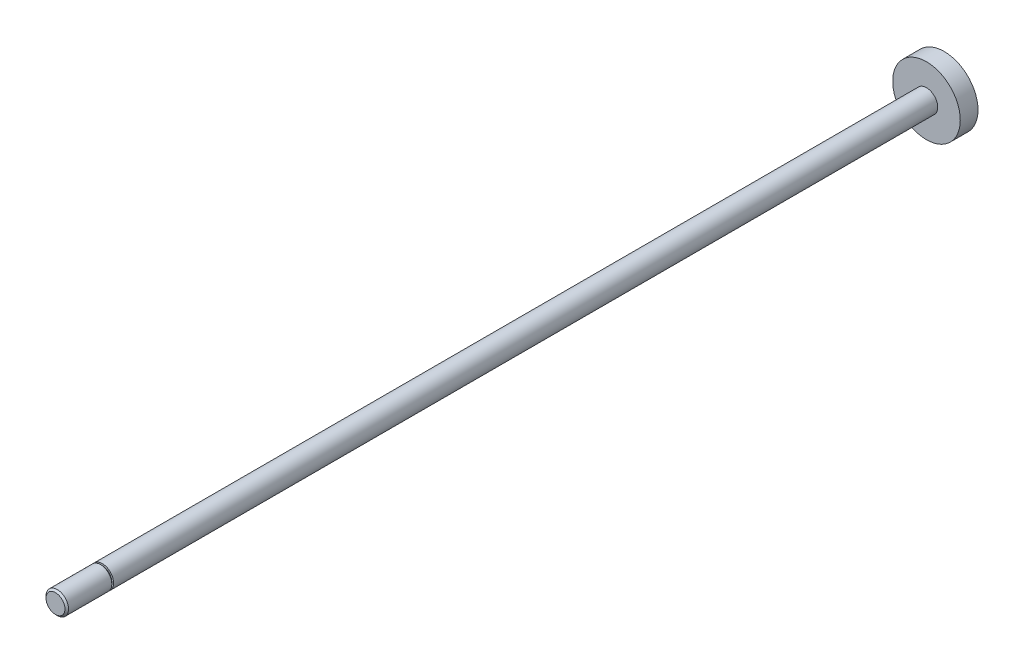
ISO-10303-21;
HEADER;
FILE_DESCRIPTION(('STEP AP214'),'2;1');
FILE_NAME('part.step','',(''),(''),'','','');
FILE_SCHEMA(('AUTOMOTIVE_DESIGN { 1 0 10303 214 1 1 1 1 }'));
ENDSEC;
DATA;
#1=APPLICATION_CONTEXT('core data for automotive mechanical design processes');
#2=APPLICATION_PROTOCOL_DEFINITION('international standard','automotive_design',2000,#1);
#3=PRODUCT_CONTEXT('',#1,'mechanical');
#4=PRODUCT('Part','Part','',(#3));
#5=PRODUCT_RELATED_PRODUCT_CATEGORY('part','',(#4));
#6=PRODUCT_DEFINITION_FORMATION('','',#4);
#7=PRODUCT_DEFINITION_CONTEXT('part definition',#1,'design');
#8=PRODUCT_DEFINITION('design','',#6,#7);
#9=PRODUCT_DEFINITION_SHAPE('','',#8);
#10=(LENGTH_UNIT() NAMED_UNIT(*) SI_UNIT(.MILLI.,.METRE.));
#11=(NAMED_UNIT(*) PLANE_ANGLE_UNIT() SI_UNIT($,.RADIAN.));
#12=(NAMED_UNIT(*) SI_UNIT($,.STERADIAN.) SOLID_ANGLE_UNIT());
#13=UNCERTAINTY_MEASURE_WITH_UNIT(LENGTH_MEASURE(1.E-05),#10,'distance_accuracy_value','');
#14=(GEOMETRIC_REPRESENTATION_CONTEXT(3) GLOBAL_UNCERTAINTY_ASSIGNED_CONTEXT((#13)) GLOBAL_UNIT_ASSIGNED_CONTEXT((#10,
#11,#12)) REPRESENTATION_CONTEXT('',''));
#15=CARTESIAN_POINT('',(0.,0.,0.));
#16=DIRECTION('',(0.,0.,1.));
#17=DIRECTION('',(1.,0.,0.));
#18=AXIS2_PLACEMENT_3D('',#15,#16,#17);
#19=CARTESIAN_POINT('',(0.,0.,2.5));
#20=DIRECTION('',(0.,0.,1.));
#21=DIRECTION('',(1.,0.,0.));
#22=AXIS2_PLACEMENT_3D('',#19,#20,#21);
#23=PLANE('',#22);
#24=CARTESIAN_POINT('',(0.,0.,2.5));
#25=DIRECTION('',(0.,0.,1.));
#26=DIRECTION('',(1.,0.,0.));
#27=AXIS2_PLACEMENT_3D('',#24,#25,#26);
#28=CIRCLE('',#27,9.525);
#29=CARTESIAN_POINT('',(9.525,0.,2.5));
#30=VERTEX_POINT('',#29);
#31=EDGE_CURVE('E38',#30,#30,#28,.T.);
#32=ORIENTED_EDGE('',*,*,#31,.T.);
#33=EDGE_LOOP('',(#32));
#34=FACE_BOUND('',#33,.T.);
#35=CARTESIAN_POINT('',(0.,0.,2.5));
#36=DIRECTION('',(0.,0.,1.));
#37=DIRECTION('',(1.,0.,0.));
#38=AXIS2_PLACEMENT_3D('',#35,#36,#37);
#39=CIRCLE('',#38,3.175);
#40=CARTESIAN_POINT('',(3.175,0.,2.5));
#41=VERTEX_POINT('',#40);
#42=EDGE_CURVE('E10',#41,#41,#39,.T.);
#43=ORIENTED_EDGE('',*,*,#42,.F.);
#44=EDGE_LOOP('',(#43));
#45=FACE_BOUND('',#44,.T.);
#46=ADVANCED_FACE('F30',(#34,#45),#23,.T.);
#47=CARTESIAN_POINT('',(0.,0.,2.5));
#48=DIRECTION('',(0.,0.,-1.));
#49=DIRECTION('',(-1.,0.,0.));
#50=AXIS2_PLACEMENT_3D('',#47,#48,#49);
#51=CYLINDRICAL_SURFACE('',#50,9.525);
#52=ORIENTED_EDGE('',*,*,#31,.F.);
#53=EDGE_LOOP('',(#52));
#54=FACE_BOUND('',#53,.T.);
#55=CARTESIAN_POINT('',(0.,0.,-2.5));
#56=DIRECTION('',(0.,0.,1.));
#57=DIRECTION('',(1.,0.,0.));
#58=AXIS2_PLACEMENT_3D('',#55,#56,#57);
#59=CIRCLE('',#58,9.525);
#60=CARTESIAN_POINT('',(9.525,0.,-2.5));
#61=VERTEX_POINT('',#60);
#62=EDGE_CURVE('E42',#61,#61,#59,.T.);
#63=ORIENTED_EDGE('',*,*,#62,.T.);
#64=EDGE_LOOP('',(#63));
#65=FACE_BOUND('',#64,.T.);
#66=ADVANCED_FACE('F92',(#54,#65),#51,.T.);
#67=CARTESIAN_POINT('',(0.,0.,-2.5));
#68=DIRECTION('',(0.,0.,1.));
#69=DIRECTION('',(1.,0.,0.));
#70=AXIS2_PLACEMENT_3D('',#67,#68,#69);
#71=PLANE('',#70);
#72=ORIENTED_EDGE('',*,*,#62,.F.);
#73=EDGE_LOOP('',(#72));
#74=FACE_BOUND('',#73,.T.);
#75=ADVANCED_FACE('F89',(#74),#71,.F.);
#76=CARTESIAN_POINT('',(0.,0.,257.011256121069));
#77=DIRECTION('',(0.,0.,-1.));
#78=DIRECTION('',(-1.,0.,0.));
#79=AXIS2_PLACEMENT_3D('',#76,#77,#78);
#80=CYLINDRICAL_SURFACE('',#79,3.175);
#81=CARTESIAN_POINT('',(0.,0.,234.831));
#82=DIRECTION('',(0.,0.,-1.));
#83=DIRECTION('',(-1.,0.,0.));
#84=AXIS2_PLACEMENT_3D('',#81,#82,#83);
#85=CIRCLE('',#84,3.175);
#86=CARTESIAN_POINT('',(-3.175,0.,234.831));
#87=VERTEX_POINT('',#86);
#88=EDGE_CURVE('E34',#87,#87,#85,.T.);
#89=ORIENTED_EDGE('',*,*,#88,.T.);
#90=EDGE_LOOP('',(#89));
#91=FACE_BOUND('',#90,.T.);
#92=ORIENTED_EDGE('',*,*,#42,.T.);
#93=EDGE_LOOP('',(#92));
#94=FACE_BOUND('',#93,.T.);
#95=ADVANCED_FACE('F32',(#91,#94),#80,.T.);
#96=CARTESIAN_POINT('',(0.,2.67499999999996,234.831));
#97=DIRECTION('',(0.,0.,-1.));
#98=DIRECTION('',(-1.,0.,0.));
#99=AXIS2_PLACEMENT_3D('',#96,#97,#98);
#100=PLANE('',#99);
#101=CARTESIAN_POINT('',(0.,0.,234.831));
#102=DIRECTION('',(0.,0.,-1.));
#103=DIRECTION('',(-1.,0.,0.));
#104=AXIS2_PLACEMENT_3D('',#101,#102,#103);
#105=CIRCLE('',#104,2.67499999999996);
#106=CARTESIAN_POINT('',(-2.67499999999996,0.,234.831));
#107=VERTEX_POINT('',#106);
#108=EDGE_CURVE('E59',#107,#107,#105,.T.);
#109=ORIENTED_EDGE('',*,*,#108,.T.);
#110=EDGE_LOOP('',(#109));
#111=FACE_BOUND('',#110,.T.);
#112=ORIENTED_EDGE('',*,*,#88,.F.);
#113=EDGE_LOOP('',(#112));
#114=FACE_BOUND('',#113,.T.);
#115=ADVANCED_FACE('F63',(#111,#114),#100,.F.);
#116=CARTESIAN_POINT('',(0.,3.17499999999996,235.331));
#117=DIRECTION('',(0.,0.,1.));
#118=DIRECTION('',(1.,0.,0.));
#119=AXIS2_PLACEMENT_3D('',#116,#117,#118);
#120=PLANE('',#119);
#121=CARTESIAN_POINT('',(0.,0.,235.331));
#122=DIRECTION('',(0.,0.,-1.));
#123=DIRECTION('',(-1.,0.,0.));
#124=AXIS2_PLACEMENT_3D('',#121,#122,#123);
#125=CIRCLE('',#124,2.67499999999996);
#126=CARTESIAN_POINT('',(-2.67499999999996,0.,235.331));
#127=VERTEX_POINT('',#126);
#128=EDGE_CURVE('E56',#127,#127,#125,.T.);
#129=ORIENTED_EDGE('',*,*,#128,.F.);
#130=EDGE_LOOP('',(#129));
#131=FACE_BOUND('',#130,.T.);
#132=CARTESIAN_POINT('',(0.,0.,235.331));
#133=DIRECTION('',(0.,0.,-1.));
#134=DIRECTION('',(-1.,0.,0.));
#135=AXIS2_PLACEMENT_3D('',#132,#133,#134);
#136=CIRCLE('',#135,3.17499999999996);
#137=CARTESIAN_POINT('',(-3.17499999999996,0.,235.331));
#138=VERTEX_POINT('',#137);
#139=EDGE_CURVE('E53',#138,#138,#136,.T.);
#140=ORIENTED_EDGE('',*,*,#139,.T.);
#141=EDGE_LOOP('',(#140));
#142=FACE_BOUND('',#141,.T.);
#143=ADVANCED_FACE('F70',(#131,#142),#120,.F.);
#144=CARTESIAN_POINT('',(0.,0.,0.));
#145=DIRECTION('',(0.,0.,-1.));
#146=DIRECTION('',(-1.,0.,0.));
#147=AXIS2_PLACEMENT_3D('',#144,#145,#146);
#148=CYLINDRICAL_SURFACE('',#147,2.67499999999996);
#149=ORIENTED_EDGE('',*,*,#108,.F.);
#150=EDGE_LOOP('',(#149));
#151=FACE_BOUND('',#150,.T.);
#152=ORIENTED_EDGE('',*,*,#128,.T.);
#153=EDGE_LOOP('',(#152));
#154=FACE_BOUND('',#153,.T.);
#155=ADVANCED_FACE('F66',(#151,#154),#148,.T.);
#156=CARTESIAN_POINT('',(0.,0.,247.531));
#157=DIRECTION('',(0.,0.,-1.));
#158=DIRECTION('',(-1.,0.,0.));
#159=AXIS2_PLACEMENT_3D('',#156,#157,#158);
#160=CIRCLE('',#159,3.17499999999996);
#161=CARTESIAN_POINT('',(-3.17499999999996,0.,247.531));
#162=VERTEX_POINT('',#161);
#163=EDGE_CURVE('E50',#162,#162,#160,.T.);
#164=ORIENTED_EDGE('',*,*,#163,.T.);
#165=EDGE_LOOP('',(#164));
#166=FACE_BOUND('',#165,.T.);
#167=ORIENTED_EDGE('',*,*,#139,.F.);
#168=EDGE_LOOP('',(#167));
#169=FACE_BOUND('',#168,.T.);
#170=ADVANCED_FACE('F69',(#166,#169),#80,.T.);
#171=CARTESIAN_POINT('',(0.,0.,248.031));
#172=DIRECTION('',(0.,0.,-1.));
#173=DIRECTION('',(-1.,0.,0.));
#174=AXIS2_PLACEMENT_3D('',#171,#172,#173);
#175=CONICAL_SURFACE('',#174,2.67499999999995,0.78539816339746);
#176=ORIENTED_EDGE('',*,*,#163,.F.);
#177=EDGE_LOOP('',(#176));
#178=FACE_BOUND('',#177,.T.);
#179=CARTESIAN_POINT('',(0.,0.,248.031));
#180=DIRECTION('',(0.,0.,-1.));
#181=DIRECTION('',(-1.,0.,0.));
#182=AXIS2_PLACEMENT_3D('',#179,#180,#181);
#183=CIRCLE('',#182,2.67499999999995);
#184=CARTESIAN_POINT('',(-2.67499999999995,0.,248.031));
#185=VERTEX_POINT('',#184);
#186=EDGE_CURVE('E47',#185,#185,#183,.T.);
#187=ORIENTED_EDGE('',*,*,#186,.T.);
#188=EDGE_LOOP('',(#187));
#189=FACE_BOUND('',#188,.T.);
#190=ADVANCED_FACE('F80',(#178,#189),#175,.T.);
#191=CARTESIAN_POINT('',(0.,0.,248.031));
#192=DIRECTION('',(0.,0.,-1.));
#193=DIRECTION('',(-1.,0.,0.));
#194=AXIS2_PLACEMENT_3D('',#191,#192,#193);
#195=PLANE('',#194);
#196=ORIENTED_EDGE('',*,*,#186,.F.);
#197=EDGE_LOOP('',(#196));
#198=FACE_BOUND('',#197,.T.);
#199=ADVANCED_FACE('F85',(#198),#195,.F.);
#200=CLOSED_SHELL('',(#46,#66,#75,#95,#115,#143,#155,#170,#190,#199));
#201=MANIFOLD_SOLID_BREP('B2',#200);
#202=ADVANCED_BREP_SHAPE_REPRESENTATION('',(#18,#201),#14);
#203=SHAPE_DEFINITION_REPRESENTATION(#9,#202);
ENDSEC;
END-ISO-10303-21;
